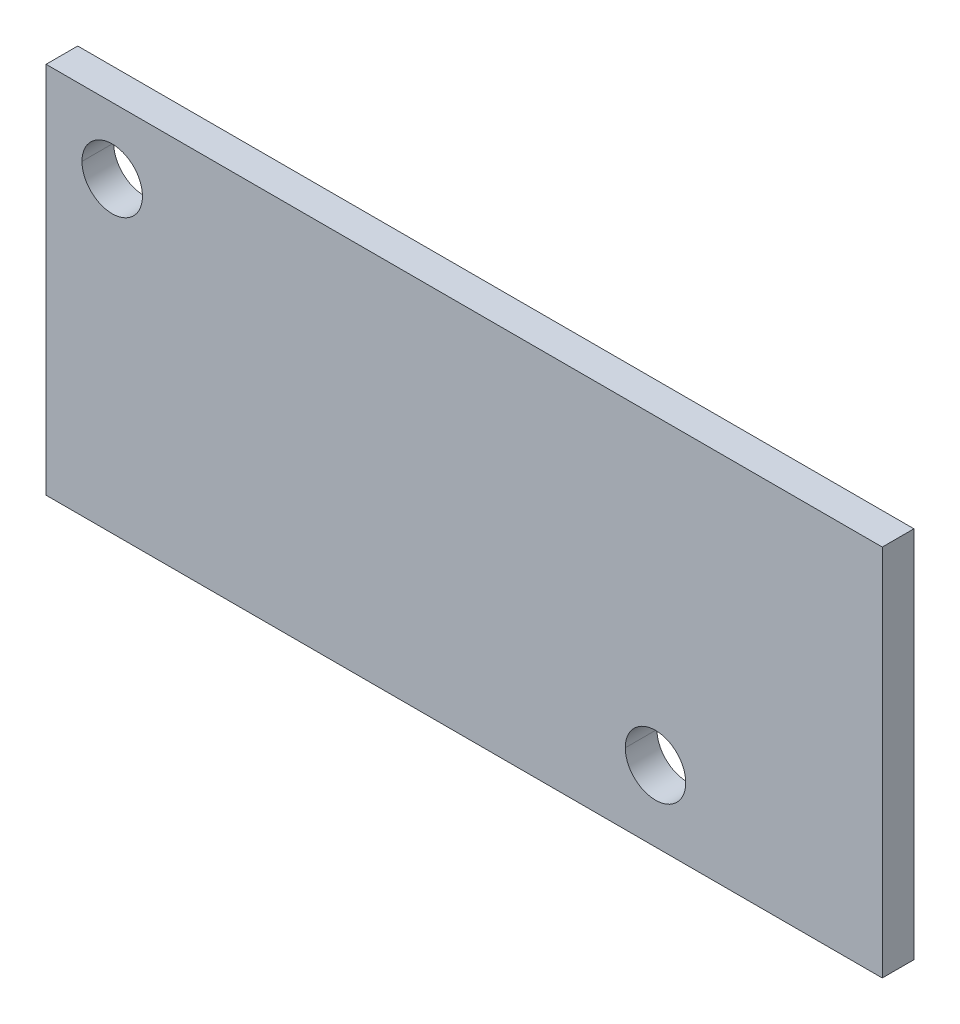
ISO-10303-21;
HEADER;
FILE_DESCRIPTION(('STEP AP214'),'2;1');
FILE_NAME('part.step','',(''),(''),'','','');
FILE_SCHEMA(('AUTOMOTIVE_DESIGN { 1 0 10303 214 1 1 1 1 }'));
ENDSEC;
DATA;
#1=APPLICATION_CONTEXT('core data for automotive mechanical design processes');
#2=APPLICATION_PROTOCOL_DEFINITION('international standard','automotive_design',2000,#1);
#3=PRODUCT_CONTEXT('',#1,'mechanical');
#4=PRODUCT('Part','Part','',(#3));
#5=PRODUCT_RELATED_PRODUCT_CATEGORY('part','',(#4));
#6=PRODUCT_DEFINITION_FORMATION('','',#4);
#7=PRODUCT_DEFINITION_CONTEXT('part definition',#1,'design');
#8=PRODUCT_DEFINITION('design','',#6,#7);
#9=PRODUCT_DEFINITION_SHAPE('','',#8);
#10=(LENGTH_UNIT() NAMED_UNIT(*) SI_UNIT(.MILLI.,.METRE.));
#11=(NAMED_UNIT(*) PLANE_ANGLE_UNIT() SI_UNIT($,.RADIAN.));
#12=(NAMED_UNIT(*) SI_UNIT($,.STERADIAN.) SOLID_ANGLE_UNIT());
#13=UNCERTAINTY_MEASURE_WITH_UNIT(LENGTH_MEASURE(1.E-05),#10,'distance_accuracy_value','');
#14=(GEOMETRIC_REPRESENTATION_CONTEXT(3) GLOBAL_UNCERTAINTY_ASSIGNED_CONTEXT((#13)) GLOBAL_UNIT_ASSIGNED_CONTEXT((#10,
#11,#12)) REPRESENTATION_CONTEXT('',''));
#15=CARTESIAN_POINT('',(0.,0.,0.));
#16=DIRECTION('',(0.,0.,1.));
#17=DIRECTION('',(1.,0.,0.));
#18=AXIS2_PLACEMENT_3D('',#15,#16,#17);
#19=CARTESIAN_POINT('',(3.556,16.51,1.7018));
#20=DIRECTION('',(0.,0.,-1.));
#21=DIRECTION('',(1.,0.,0.));
#22=AXIS2_PLACEMENT_3D('',#19,#20,#21);
#23=CYLINDRICAL_SURFACE('',#22,1.6256);
#24=DIRECTION('',(0.,0.,-1.));
#25=VECTOR('',#24,1.);
#26=CARTESIAN_POINT('',(1.9304,16.51,1.7018));
#27=LINE('',#26,#25);
#28=CARTESIAN_POINT('',(1.9304,16.51,1.7018));
#29=VERTEX_POINT('',#28);
#30=CARTESIAN_POINT('',(1.9304,16.51,0.));
#31=VERTEX_POINT('',#30);
#32=EDGE_CURVE('E144',#29,#31,#27,.T.);
#33=ORIENTED_EDGE('',*,*,#32,.F.);
#34=CARTESIAN_POINT('',(3.556,16.51,1.7018));
#35=DIRECTION('',(0.,0.,-1.));
#36=DIRECTION('',(1.,0.,0.));
#37=AXIS2_PLACEMENT_3D('',#34,#35,#36);
#38=CIRCLE('',#37,1.6256);
#39=CARTESIAN_POINT('',(5.1816,16.51,1.7018));
#40=VERTEX_POINT('',#39);
#41=EDGE_CURVE('E143',#40,#29,#38,.T.);
#42=ORIENTED_EDGE('',*,*,#41,.F.);
#43=DIRECTION('',(0.,0.,-1.));
#44=VECTOR('',#43,1.);
#45=CARTESIAN_POINT('',(5.1816,16.51,1.7018));
#46=LINE('',#45,#44);
#47=CARTESIAN_POINT('',(5.1816,16.51,0.));
#48=VERTEX_POINT('',#47);
#49=EDGE_CURVE('E154',#40,#48,#46,.T.);
#50=ORIENTED_EDGE('',*,*,#49,.T.);
#51=CARTESIAN_POINT('',(3.556,16.51,0.));
#52=DIRECTION('',(0.,0.,1.));
#53=DIRECTION('',(1.,0.,0.));
#54=AXIS2_PLACEMENT_3D('',#51,#52,#53);
#55=CIRCLE('',#54,1.6256);
#56=EDGE_CURVE('E130',#31,#48,#55,.T.);
#57=ORIENTED_EDGE('',*,*,#56,.F.);
#58=EDGE_LOOP('',(#33,#42,#50,#57));
#59=FACE_BOUND('',#58,.T.);
#60=ADVANCED_FACE('F16',(#59),#23,.F.);
#61=CARTESIAN_POINT('',(32.766,3.81,1.7018));
#62=DIRECTION('',(0.,0.,-1.));
#63=DIRECTION('',(1.,0.,0.));
#64=AXIS2_PLACEMENT_3D('',#61,#62,#63);
#65=CYLINDRICAL_SURFACE('',#64,1.6256);
#66=DIRECTION('',(0.,0.,-1.));
#67=VECTOR('',#66,1.);
#68=CARTESIAN_POINT('',(31.1404,3.81,1.7018));
#69=LINE('',#68,#67);
#70=CARTESIAN_POINT('',(31.1404,3.81,1.7018));
#71=VERTEX_POINT('',#70);
#72=CARTESIAN_POINT('',(31.1404,3.81,0.));
#73=VERTEX_POINT('',#72);
#74=EDGE_CURVE('E153',#71,#73,#69,.T.);
#75=ORIENTED_EDGE('',*,*,#74,.F.);
#76=CARTESIAN_POINT('',(32.766,3.81,1.7018));
#77=DIRECTION('',(0.,0.,-1.));
#78=DIRECTION('',(1.,0.,0.));
#79=AXIS2_PLACEMENT_3D('',#76,#77,#78);
#80=CIRCLE('',#79,1.6256);
#81=CARTESIAN_POINT('',(34.3916,3.81,1.7018));
#82=VERTEX_POINT('',#81);
#83=EDGE_CURVE('E124',#82,#71,#80,.T.);
#84=ORIENTED_EDGE('',*,*,#83,.F.);
#85=DIRECTION('',(0.,0.,-1.));
#86=VECTOR('',#85,1.);
#87=CARTESIAN_POINT('',(34.3916,3.81,1.7018));
#88=LINE('',#87,#86);
#89=CARTESIAN_POINT('',(34.3916,3.81,0.));
#90=VERTEX_POINT('',#89);
#91=EDGE_CURVE('E175',#82,#90,#88,.T.);
#92=ORIENTED_EDGE('',*,*,#91,.T.);
#93=CARTESIAN_POINT('',(32.766,3.81,0.));
#94=DIRECTION('',(0.,0.,1.));
#95=DIRECTION('',(1.,0.,0.));
#96=AXIS2_PLACEMENT_3D('',#93,#94,#95);
#97=CIRCLE('',#96,1.6256);
#98=EDGE_CURVE('E138',#73,#90,#97,.T.);
#99=ORIENTED_EDGE('',*,*,#98,.F.);
#100=EDGE_LOOP('',(#75,#84,#92,#99));
#101=FACE_BOUND('',#100,.T.);
#102=ADVANCED_FACE('F335',(#101),#65,.F.);
#103=CARTESIAN_POINT('',(44.958,20.066,0.));
#104=DIRECTION('',(0.,1.,0.));
#105=DIRECTION('',(1.,0.,0.));
#106=AXIS2_PLACEMENT_3D('',#103,#104,#105);
#107=PLANE('',#106);
#108=DIRECTION('',(-1.,0.,0.));
#109=VECTOR('',#108,1.);
#110=CARTESIAN_POINT('',(44.958,20.066,0.));
#111=LINE('',#110,#109);
#112=CARTESIAN_POINT('',(44.958,20.066,0.));
#113=VERTEX_POINT('',#112);
#114=CARTESIAN_POINT('',(0.,20.066,0.));
#115=VERTEX_POINT('',#114);
#116=EDGE_CURVE('E109',#113,#115,#111,.T.);
#117=ORIENTED_EDGE('',*,*,#116,.T.);
#118=DIRECTION('',(0.,0.,1.));
#119=VECTOR('',#118,1.);
#120=CARTESIAN_POINT('',(0.,20.066,0.));
#121=LINE('',#120,#119);
#122=CARTESIAN_POINT('',(0.,20.066,1.7018));
#123=VERTEX_POINT('',#122);
#124=EDGE_CURVE('E103',#115,#123,#121,.T.);
#125=ORIENTED_EDGE('',*,*,#124,.T.);
#126=DIRECTION('',(-1.,0.,0.));
#127=VECTOR('',#126,1.);
#128=CARTESIAN_POINT('',(44.958,20.066,1.7018));
#129=LINE('',#128,#127);
#130=CARTESIAN_POINT('',(44.958,20.066,1.7018));
#131=VERTEX_POINT('',#130);
#132=EDGE_CURVE('E106',#131,#123,#129,.T.);
#133=ORIENTED_EDGE('',*,*,#132,.F.);
#134=DIRECTION('',(0.,0.,1.));
#135=VECTOR('',#134,1.);
#136=CARTESIAN_POINT('',(44.958,20.066,0.));
#137=LINE('',#136,#135);
#138=EDGE_CURVE('E11',#113,#131,#137,.T.);
#139=ORIENTED_EDGE('',*,*,#138,.F.);
#140=EDGE_LOOP('',(#117,#125,#133,#139));
#141=FACE_BOUND('',#140,.T.);
#142=ADVANCED_FACE('F105',(#141),#107,.T.);
#143=CARTESIAN_POINT('',(44.958,0.,0.));
#144=DIRECTION('',(1.,0.,0.));
#145=DIRECTION('',(0.,1.,0.));
#146=AXIS2_PLACEMENT_3D('',#143,#144,#145);
#147=PLANE('',#146);
#148=DIRECTION('',(0.,1.,0.));
#149=VECTOR('',#148,1.);
#150=CARTESIAN_POINT('',(44.958,0.,0.));
#151=LINE('',#150,#149);
#152=CARTESIAN_POINT('',(44.958,0.,0.));
#153=VERTEX_POINT('',#152);
#154=EDGE_CURVE('E157',#153,#113,#151,.T.);
#155=ORIENTED_EDGE('',*,*,#154,.T.);
#156=ORIENTED_EDGE('',*,*,#138,.T.);
#157=DIRECTION('',(0.,1.,0.));
#158=VECTOR('',#157,1.);
#159=CARTESIAN_POINT('',(44.958,0.,1.7018));
#160=LINE('',#159,#158);
#161=CARTESIAN_POINT('',(44.958,0.,1.7018));
#162=VERTEX_POINT('',#161);
#163=EDGE_CURVE('E122',#162,#131,#160,.T.);
#164=ORIENTED_EDGE('',*,*,#163,.F.);
#165=DIRECTION('',(0.,0.,1.));
#166=VECTOR('',#165,1.);
#167=CARTESIAN_POINT('',(44.958,0.,0.));
#168=LINE('',#167,#166);
#169=EDGE_CURVE('E27',#153,#162,#168,.T.);
#170=ORIENTED_EDGE('',*,*,#169,.F.);
#171=EDGE_LOOP('',(#155,#156,#164,#170));
#172=FACE_BOUND('',#171,.T.);
#173=ADVANCED_FACE('F347',(#172),#147,.T.);
#174=CARTESIAN_POINT('',(0.,0.,0.));
#175=DIRECTION('',(0.,-1.,0.));
#176=DIRECTION('',(0.,0.,-1.));
#177=AXIS2_PLACEMENT_3D('',#174,#175,#176);
#178=PLANE('',#177);
#179=DIRECTION('',(1.,0.,0.));
#180=VECTOR('',#179,1.);
#181=CARTESIAN_POINT('',(0.,0.,0.));
#182=LINE('',#181,#180);
#183=CARTESIAN_POINT('',(0.,0.,0.));
#184=VERTEX_POINT('',#183);
#185=EDGE_CURVE('E155',#184,#153,#182,.T.);
#186=ORIENTED_EDGE('',*,*,#185,.T.);
#187=ORIENTED_EDGE('',*,*,#169,.T.);
#188=DIRECTION('',(1.,0.,0.));
#189=VECTOR('',#188,1.);
#190=CARTESIAN_POINT('',(0.,0.,1.7018));
#191=LINE('',#190,#189);
#192=CARTESIAN_POINT('',(0.,0.,1.7018));
#193=VERTEX_POINT('',#192);
#194=EDGE_CURVE('E129',#193,#162,#191,.T.);
#195=ORIENTED_EDGE('',*,*,#194,.F.);
#196=DIRECTION('',(0.,0.,1.));
#197=VECTOR('',#196,1.);
#198=CARTESIAN_POINT('',(0.,0.,0.));
#199=LINE('',#198,#197);
#200=EDGE_CURVE('E115',#184,#193,#199,.T.);
#201=ORIENTED_EDGE('',*,*,#200,.F.);
#202=EDGE_LOOP('',(#186,#187,#195,#201));
#203=FACE_BOUND('',#202,.T.);
#204=ADVANCED_FACE('F330',(#203),#178,.T.);
#205=CARTESIAN_POINT('',(0.,20.066,0.));
#206=DIRECTION('',(-1.,0.,0.));
#207=DIRECTION('',(0.,1.,0.));
#208=AXIS2_PLACEMENT_3D('',#205,#206,#207);
#209=PLANE('',#208);
#210=DIRECTION('',(0.,-1.,0.));
#211=VECTOR('',#210,1.);
#212=CARTESIAN_POINT('',(0.,20.066,0.));
#213=LINE('',#212,#211);
#214=EDGE_CURVE('E169',#115,#184,#213,.T.);
#215=ORIENTED_EDGE('',*,*,#214,.T.);
#216=ORIENTED_EDGE('',*,*,#200,.T.);
#217=DIRECTION('',(0.,-1.,0.));
#218=VECTOR('',#217,1.);
#219=CARTESIAN_POINT('',(0.,20.066,1.7018));
#220=LINE('',#219,#218);
#221=EDGE_CURVE('E121',#123,#193,#220,.T.);
#222=ORIENTED_EDGE('',*,*,#221,.F.);
#223=ORIENTED_EDGE('',*,*,#124,.F.);
#224=EDGE_LOOP('',(#215,#216,#222,#223));
#225=FACE_BOUND('',#224,.T.);
#226=ADVANCED_FACE('F126',(#225),#209,.T.);
#227=CARTESIAN_POINT('',(22.479,10.033,1.7018));
#228=DIRECTION('',(0.,0.,1.));
#229=DIRECTION('',(1.,0.,0.));
#230=AXIS2_PLACEMENT_3D('',#227,#228,#229);
#231=PLANE('',#230);
#232=ORIENTED_EDGE('',*,*,#41,.T.);
#233=CARTESIAN_POINT('',(3.556,16.51,1.7018));
#234=DIRECTION('',(0.,0.,-1.));
#235=DIRECTION('',(1.,0.,0.));
#236=AXIS2_PLACEMENT_3D('',#233,#234,#235);
#237=CIRCLE('',#236,1.6256);
#238=EDGE_CURVE('E148',#29,#40,#237,.T.);
#239=ORIENTED_EDGE('',*,*,#238,.T.);
#240=EDGE_LOOP('',(#232,#239));
#241=FACE_BOUND('',#240,.T.);
#242=ORIENTED_EDGE('',*,*,#83,.T.);
#243=CARTESIAN_POINT('',(32.766,3.81,1.7018));
#244=DIRECTION('',(0.,0.,-1.));
#245=DIRECTION('',(1.,0.,0.));
#246=AXIS2_PLACEMENT_3D('',#243,#244,#245);
#247=CIRCLE('',#246,1.6256);
#248=EDGE_CURVE('E149',#71,#82,#247,.T.);
#249=ORIENTED_EDGE('',*,*,#248,.T.);
#250=EDGE_LOOP('',(#242,#249));
#251=FACE_BOUND('',#250,.T.);
#252=ORIENTED_EDGE('',*,*,#221,.T.);
#253=ORIENTED_EDGE('',*,*,#194,.T.);
#254=ORIENTED_EDGE('',*,*,#163,.T.);
#255=ORIENTED_EDGE('',*,*,#132,.T.);
#256=EDGE_LOOP('',(#252,#253,#254,#255));
#257=FACE_BOUND('',#256,.T.);
#258=ADVANCED_FACE('F119',(#241,#251,#257),#231,.T.);
#259=CARTESIAN_POINT('',(22.479,10.033,0.));
#260=DIRECTION('',(0.,0.,1.));
#261=DIRECTION('',(1.,0.,0.));
#262=AXIS2_PLACEMENT_3D('',#259,#260,#261);
#263=PLANE('',#262);
#264=CARTESIAN_POINT('',(3.556,16.51,0.));
#265=DIRECTION('',(0.,0.,1.));
#266=DIRECTION('',(1.,0.,0.));
#267=AXIS2_PLACEMENT_3D('',#264,#265,#266);
#268=CIRCLE('',#267,1.6256);
#269=EDGE_CURVE('E20',#48,#31,#268,.T.);
#270=ORIENTED_EDGE('',*,*,#269,.T.);
#271=ORIENTED_EDGE('',*,*,#56,.T.);
#272=EDGE_LOOP('',(#270,#271));
#273=FACE_BOUND('',#272,.T.);
#274=CARTESIAN_POINT('',(32.766,3.81,0.));
#275=DIRECTION('',(0.,0.,1.));
#276=DIRECTION('',(1.,0.,0.));
#277=AXIS2_PLACEMENT_3D('',#274,#275,#276);
#278=CIRCLE('',#277,1.6256);
#279=EDGE_CURVE('E162',#90,#73,#278,.T.);
#280=ORIENTED_EDGE('',*,*,#279,.T.);
#281=ORIENTED_EDGE('',*,*,#98,.T.);
#282=EDGE_LOOP('',(#280,#281));
#283=FACE_BOUND('',#282,.T.);
#284=ORIENTED_EDGE('',*,*,#214,.F.);
#285=ORIENTED_EDGE('',*,*,#116,.F.);
#286=ORIENTED_EDGE('',*,*,#154,.F.);
#287=ORIENTED_EDGE('',*,*,#185,.F.);
#288=EDGE_LOOP('',(#284,#285,#286,#287));
#289=FACE_BOUND('',#288,.T.);
#290=ADVANCED_FACE('F204',(#273,#283,#289),#263,.F.);
#291=CARTESIAN_POINT('',(32.766,3.81,1.7018));
#292=DIRECTION('',(0.,0.,-1.));
#293=DIRECTION('',(1.,0.,0.));
#294=AXIS2_PLACEMENT_3D('',#291,#292,#293);
#295=CYLINDRICAL_SURFACE('',#294,1.6256);
#296=ORIENTED_EDGE('',*,*,#248,.F.);
#297=ORIENTED_EDGE('',*,*,#74,.T.);
#298=ORIENTED_EDGE('',*,*,#279,.F.);
#299=ORIENTED_EDGE('',*,*,#91,.F.);
#300=EDGE_LOOP('',(#296,#297,#298,#299));
#301=FACE_BOUND('',#300,.T.);
#302=ADVANCED_FACE('F18',(#301),#295,.F.);
#303=CARTESIAN_POINT('',(3.556,16.51,1.7018));
#304=DIRECTION('',(0.,0.,-1.));
#305=DIRECTION('',(1.,0.,0.));
#306=AXIS2_PLACEMENT_3D('',#303,#304,#305);
#307=CYLINDRICAL_SURFACE('',#306,1.6256);
#308=ORIENTED_EDGE('',*,*,#238,.F.);
#309=ORIENTED_EDGE('',*,*,#32,.T.);
#310=ORIENTED_EDGE('',*,*,#269,.F.);
#311=ORIENTED_EDGE('',*,*,#49,.F.);
#312=EDGE_LOOP('',(#308,#309,#310,#311));
#313=FACE_BOUND('',#312,.T.);
#314=ADVANCED_FACE('F199',(#313),#307,.F.);
#315=CLOSED_SHELL('',(#60,#102,#142,#173,#204,#226,#258,#290,#302,#314));
#316=MANIFOLD_SOLID_BREP('B1',#315);
#317=ADVANCED_BREP_SHAPE_REPRESENTATION('',(#18,#316),#14);
#318=SHAPE_DEFINITION_REPRESENTATION(#9,#317);
ENDSEC;
END-ISO-10303-21;
